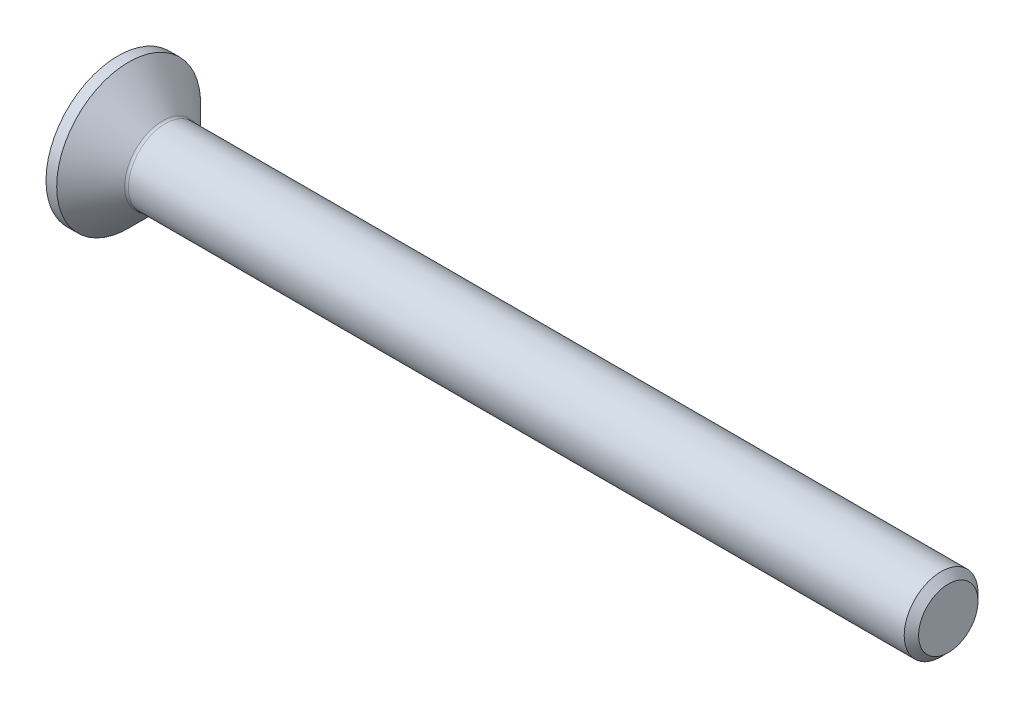
ISO-10303-21;
HEADER;
FILE_DESCRIPTION(('STEP AP214'),'2;1');
FILE_NAME('part.step','',(''),(''),'','','');
FILE_SCHEMA(('AUTOMOTIVE_DESIGN { 1 0 10303 214 1 1 1 1 }'));
ENDSEC;
DATA;
#1=APPLICATION_CONTEXT('core data for automotive mechanical design processes');
#2=APPLICATION_PROTOCOL_DEFINITION('international standard','automotive_design',2000,#1);
#3=PRODUCT_CONTEXT('',#1,'mechanical');
#4=PRODUCT('Part','Part','',(#3));
#5=PRODUCT_RELATED_PRODUCT_CATEGORY('part','',(#4));
#6=PRODUCT_DEFINITION_FORMATION('','',#4);
#7=PRODUCT_DEFINITION_CONTEXT('part definition',#1,'design');
#8=PRODUCT_DEFINITION('design','',#6,#7);
#9=PRODUCT_DEFINITION_SHAPE('','',#8);
#10=(LENGTH_UNIT() NAMED_UNIT(*) SI_UNIT(.MILLI.,.METRE.));
#11=(NAMED_UNIT(*) PLANE_ANGLE_UNIT() SI_UNIT($,.RADIAN.));
#12=(NAMED_UNIT(*) SI_UNIT($,.STERADIAN.) SOLID_ANGLE_UNIT());
#13=UNCERTAINTY_MEASURE_WITH_UNIT(LENGTH_MEASURE(1.E-05),#10,'distance_accuracy_value','');
#14=(GEOMETRIC_REPRESENTATION_CONTEXT(3) GLOBAL_UNCERTAINTY_ASSIGNED_CONTEXT((#13)) GLOBAL_UNIT_ASSIGNED_CONTEXT((#10,
#11,#12)) REPRESENTATION_CONTEXT('',''));
#15=CARTESIAN_POINT('',(0.,0.,0.));
#16=DIRECTION('',(0.,0.,1.));
#17=DIRECTION('',(1.,0.,0.));
#18=AXIS2_PLACEMENT_3D('',#15,#16,#17);
#19=CARTESIAN_POINT('',(0.,0.,0.));
#20=DIRECTION('',(-1.,0.,0.));
#21=DIRECTION('',(0.,0.,1.));
#22=AXIS2_PLACEMENT_3D('',#19,#20,#21);
#23=PLANE('',#22);
#24=CARTESIAN_POINT('',(0.,0.,0.));
#25=DIRECTION('',(-1.,0.,0.));
#26=DIRECTION('',(0.,0.,1.));
#27=AXIS2_PLACEMENT_3D('',#24,#25,#26);
#28=CIRCLE('',#27,3.9);
#29=CARTESIAN_POINT('',(0.,0.,3.9));
#30=VERTEX_POINT('',#29);
#31=EDGE_CURVE('E153',#30,#30,#28,.T.);
#32=ORIENTED_EDGE('',*,*,#31,.T.);
#33=EDGE_LOOP('',(#32));
#34=FACE_BOUND('',#33,.T.);
#35=DIRECTION('',(0.,-0.500000000000001,-0.866025403784438));
#36=VECTOR('',#35,1.);
#37=CARTESIAN_POINT('',(0.,-0.721687836487031,1.25));
#38=LINE('',#37,#36);
#39=CARTESIAN_POINT('',(0.,-0.721687836487031,1.25));
#40=VERTEX_POINT('',#39);
#41=CARTESIAN_POINT('',(0.,-1.44337567297407,0.));
#42=VERTEX_POINT('',#41);
#43=EDGE_CURVE('E115',#40,#42,#38,.T.);
#44=ORIENTED_EDGE('',*,*,#43,.T.);
#45=DIRECTION('',(0.,0.5,-0.866025403784438));
#46=VECTOR('',#45,1.);
#47=CARTESIAN_POINT('',(0.,-1.44337567297407,0.));
#48=LINE('',#47,#46);
#49=CARTESIAN_POINT('',(0.,-0.721687836487032,-1.25));
#50=VERTEX_POINT('',#49);
#51=EDGE_CURVE('E45',#42,#50,#48,.T.);
#52=ORIENTED_EDGE('',*,*,#51,.T.);
#53=DIRECTION('',(0.,1.,0.));
#54=VECTOR('',#53,1.);
#55=CARTESIAN_POINT('',(0.,-0.721687836487032,-1.25));
#56=LINE('',#55,#54);
#57=CARTESIAN_POINT('',(0.,0.721687836487033,-1.25));
#58=VERTEX_POINT('',#57);
#59=EDGE_CURVE('E130',#50,#58,#56,.T.);
#60=ORIENTED_EDGE('',*,*,#59,.T.);
#61=DIRECTION('',(0.,0.500000000000001,0.866025403784438));
#62=VECTOR('',#61,1.);
#63=CARTESIAN_POINT('',(0.,0.721687836487033,-1.25));
#64=LINE('',#63,#62);
#65=CARTESIAN_POINT('',(0.,1.44337567297407,0.));
#66=VERTEX_POINT('',#65);
#67=EDGE_CURVE('E266',#58,#66,#64,.T.);
#68=ORIENTED_EDGE('',*,*,#67,.T.);
#69=DIRECTION('',(0.,-0.5,0.866025403784439));
#70=VECTOR('',#69,1.);
#71=CARTESIAN_POINT('',(0.,1.44337567297407,0.));
#72=LINE('',#71,#70);
#73=CARTESIAN_POINT('',(0.,0.721687836487033,1.25));
#74=VERTEX_POINT('',#73);
#75=EDGE_CURVE('E269',#66,#74,#72,.T.);
#76=ORIENTED_EDGE('',*,*,#75,.T.);
#77=DIRECTION('',(0.,-1.,0.));
#78=VECTOR('',#77,1.);
#79=CARTESIAN_POINT('',(0.,0.721687836487033,1.25));
#80=LINE('',#79,#78);
#81=EDGE_CURVE('E272',#74,#40,#80,.T.);
#82=ORIENTED_EDGE('',*,*,#81,.T.);
#83=EDGE_LOOP('',(#44,#52,#60,#68,#76,#82));
#84=FACE_BOUND('',#83,.T.);
#85=ADVANCED_FACE('F30',(#34,#84),#23,.T.);
#86=CARTESIAN_POINT('',(0.,0.,0.));
#87=DIRECTION('',(-1.,0.,0.));
#88=DIRECTION('',(0.,0.,1.));
#89=AXIS2_PLACEMENT_3D('',#86,#87,#88);
#90=CYLINDRICAL_SURFACE('',#89,3.9);
#91=CARTESIAN_POINT('',(0.580000000000009,0.,0.));
#92=DIRECTION('',(-1.,0.,0.));
#93=DIRECTION('',(0.,0.,1.));
#94=AXIS2_PLACEMENT_3D('',#91,#92,#93);
#95=CIRCLE('',#94,3.9);
#96=CARTESIAN_POINT('',(0.580000000000009,0.,3.9));
#97=VERTEX_POINT('',#96);
#98=EDGE_CURVE('E150',#97,#97,#95,.T.);
#99=ORIENTED_EDGE('',*,*,#98,.T.);
#100=EDGE_LOOP('',(#99));
#101=FACE_BOUND('',#100,.T.);
#102=ORIENTED_EDGE('',*,*,#31,.F.);
#103=EDGE_LOOP('',(#102));
#104=FACE_BOUND('',#103,.T.);
#105=ADVANCED_FACE('F174',(#101,#104),#90,.T.);
#106=CARTESIAN_POINT('',(0.580000000000009,0.,0.));
#107=DIRECTION('',(-1.,0.,0.));
#108=DIRECTION('',(0.,0.,1.));
#109=AXIS2_PLACEMENT_3D('',#106,#107,#108);
#110=CONICAL_SURFACE('',#109,3.9,0.785398163397451);
#111=CARTESIAN_POINT('',(2.42142135623731,0.,0.));
#112=DIRECTION('',(-1.,0.,0.));
#113=DIRECTION('',(0.,0.,1.));
#114=AXIS2_PLACEMENT_3D('',#111,#112,#113);
#115=CIRCLE('',#114,2.05857864376269);
#116=CARTESIAN_POINT('',(2.42142135623731,0.,2.05857864376269));
#117=VERTEX_POINT('',#116);
#118=EDGE_CURVE('E38',#117,#117,#115,.T.);
#119=ORIENTED_EDGE('',*,*,#118,.T.);
#120=EDGE_LOOP('',(#119));
#121=FACE_BOUND('',#120,.T.);
#122=ORIENTED_EDGE('',*,*,#98,.F.);
#123=EDGE_LOOP('',(#122));
#124=FACE_BOUND('',#123,.T.);
#125=ADVANCED_FACE('F158',(#121,#124),#110,.T.);
#126=CARTESIAN_POINT('',(0.,0.,0.));
#127=DIRECTION('',(-1.,0.,0.));
#128=DIRECTION('',(0.,0.,1.));
#129=AXIS2_PLACEMENT_3D('',#126,#127,#128);
#130=CYLINDRICAL_SURFACE('',#129,2.);
#131=CARTESIAN_POINT('',(2.56284271247462,0.,0.));
#132=DIRECTION('',(-1.,0.,0.));
#133=DIRECTION('',(0.,0.,1.));
#134=AXIS2_PLACEMENT_3D('',#131,#132,#133);
#135=CIRCLE('',#134,2.);
#136=CARTESIAN_POINT('',(2.56284271247462,0.,2.));
#137=VERTEX_POINT('',#136);
#138=EDGE_CURVE('E11',#137,#137,#135,.F.);
#139=ORIENTED_EDGE('',*,*,#138,.T.);
#140=EDGE_LOOP('',(#139));
#141=FACE_BOUND('',#140,.T.);
#142=CARTESIAN_POINT('',(44.61,0.,0.));
#143=DIRECTION('',(-1.,0.,0.));
#144=DIRECTION('',(0.,0.,1.));
#145=AXIS2_PLACEMENT_3D('',#142,#143,#144);
#146=CIRCLE('',#145,2.);
#147=CARTESIAN_POINT('',(44.61,0.,2.));
#148=VERTEX_POINT('',#147);
#149=EDGE_CURVE('E147',#148,#148,#146,.T.);
#150=ORIENTED_EDGE('',*,*,#149,.T.);
#151=EDGE_LOOP('',(#150));
#152=FACE_BOUND('',#151,.T.);
#153=ADVANCED_FACE('F185',(#141,#152),#130,.T.);
#154=CARTESIAN_POINT('',(45.,0.,0.));
#155=DIRECTION('',(-1.,0.,0.));
#156=DIRECTION('',(0.,0.,1.));
#157=AXIS2_PLACEMENT_3D('',#154,#155,#156);
#158=CONICAL_SURFACE('',#157,1.61,0.785398163397435);
#159=ORIENTED_EDGE('',*,*,#149,.F.);
#160=EDGE_LOOP('',(#159));
#161=FACE_BOUND('',#160,.T.);
#162=CARTESIAN_POINT('',(45.,0.,0.));
#163=DIRECTION('',(-1.,0.,0.));
#164=DIRECTION('',(0.,0.,1.));
#165=AXIS2_PLACEMENT_3D('',#162,#163,#164);
#166=CIRCLE('',#165,1.61);
#167=CARTESIAN_POINT('',(45.,0.,1.61));
#168=VERTEX_POINT('',#167);
#169=EDGE_CURVE('E143',#168,#168,#166,.T.);
#170=ORIENTED_EDGE('',*,*,#169,.T.);
#171=EDGE_LOOP('',(#170));
#172=FACE_BOUND('',#171,.T.);
#173=ADVANCED_FACE('F169',(#161,#172),#158,.T.);
#174=CARTESIAN_POINT('',(45.,1.61,0.));
#175=DIRECTION('',(1.,0.,0.));
#176=DIRECTION('',(0.,0.,-1.));
#177=AXIS2_PLACEMENT_3D('',#174,#175,#176);
#178=PLANE('',#177);
#179=ORIENTED_EDGE('',*,*,#169,.F.);
#180=EDGE_LOOP('',(#179));
#181=FACE_BOUND('',#180,.T.);
#182=ADVANCED_FACE('F162',(#181),#178,.T.);
#183=CARTESIAN_POINT('',(2.56284271247462,0.,0.));
#184=DIRECTION('',(-1.,0.,0.));
#185=DIRECTION('',(0.,0.,1.));
#186=AXIS2_PLACEMENT_3D('',#183,#184,#185);
#187=TOROIDAL_SURFACE('',#186,2.2,0.2);
#188=ORIENTED_EDGE('',*,*,#138,.F.);
#189=EDGE_LOOP('',(#188));
#190=FACE_BOUND('',#189,.T.);
#191=ORIENTED_EDGE('',*,*,#118,.F.);
#192=EDGE_LOOP('',(#191));
#193=FACE_BOUND('',#192,.T.);
#194=ADVANCED_FACE('F32',(#190,#193),#187,.F.);
#195=CARTESIAN_POINT('',(1.5,-1.44337567297407,0.));
#196=DIRECTION('',(0.,0.866025403784438,0.500000000000001));
#197=DIRECTION('',(0.,-0.500000000000001,0.866025403784438));
#198=AXIS2_PLACEMENT_3D('',#195,#196,#197);
#199=PLANE('',#198);
#200=ORIENTED_EDGE('',*,*,#51,.F.);
#201=DIRECTION('',(-1.,0.,0.));
#202=VECTOR('',#201,1.);
#203=CARTESIAN_POINT('',(1.5,-1.44337567297407,0.));
#204=LINE('',#203,#202);
#205=CARTESIAN_POINT('',(1.5,-1.44337567297407,0.));
#206=VERTEX_POINT('',#205);
#207=EDGE_CURVE('E263',#206,#42,#204,.T.);
#208=ORIENTED_EDGE('',*,*,#207,.F.);
#209=DIRECTION('',(0.,0.5,-0.866025403784438));
#210=VECTOR('',#209,1.);
#211=CARTESIAN_POINT('',(1.5,-1.44337567297407,0.));
#212=LINE('',#211,#210);
#213=CARTESIAN_POINT('',(1.5,-1.08253175473055,-0.625000000000001));
#214=VERTEX_POINT('',#213);
#215=EDGE_CURVE('E112',#206,#214,#212,.T.);
#216=ORIENTED_EDGE('',*,*,#215,.T.);
#217=CARTESIAN_POINT('',(1.5,-0.721687836487032,-1.25));
#218=VERTEX_POINT('',#217);
#219=EDGE_CURVE('E106',#214,#218,#212,.T.);
#220=ORIENTED_EDGE('',*,*,#219,.T.);
#221=DIRECTION('',(-1.,0.,0.));
#222=VECTOR('',#221,1.);
#223=CARTESIAN_POINT('',(1.5,-0.721687836487032,-1.25));
#224=LINE('',#223,#222);
#225=EDGE_CURVE('E110',#218,#50,#224,.T.);
#226=ORIENTED_EDGE('',*,*,#225,.T.);
#227=EDGE_LOOP('',(#200,#208,#216,#220,#226));
#228=FACE_BOUND('',#227,.T.);
#229=ADVANCED_FACE('F108',(#228),#199,.T.);
#230=CARTESIAN_POINT('',(1.5,-0.721687836487032,-1.25));
#231=DIRECTION('',(0.,0.,1.));
#232=DIRECTION('',(0.,-1.,0.));
#233=AXIS2_PLACEMENT_3D('',#230,#231,#232);
#234=PLANE('',#233);
#235=ORIENTED_EDGE('',*,*,#59,.F.);
#236=ORIENTED_EDGE('',*,*,#225,.F.);
#237=DIRECTION('',(0.,1.,0.));
#238=VECTOR('',#237,1.);
#239=CARTESIAN_POINT('',(1.5,-0.721687836487032,-1.25));
#240=LINE('',#239,#238);
#241=CARTESIAN_POINT('',(1.5,0.,-1.25));
#242=VERTEX_POINT('',#241);
#243=EDGE_CURVE('E118',#218,#242,#240,.T.);
#244=ORIENTED_EDGE('',*,*,#243,.T.);
#245=CARTESIAN_POINT('',(1.5,0.721687836487033,-1.25));
#246=VERTEX_POINT('',#245);
#247=EDGE_CURVE('E125',#242,#246,#240,.T.);
#248=ORIENTED_EDGE('',*,*,#247,.T.);
#249=DIRECTION('',(-1.,0.,0.));
#250=VECTOR('',#249,1.);
#251=CARTESIAN_POINT('',(1.5,0.721687836487033,-1.25));
#252=LINE('',#251,#250);
#253=EDGE_CURVE('E132',#246,#58,#252,.T.);
#254=ORIENTED_EDGE('',*,*,#253,.T.);
#255=EDGE_LOOP('',(#235,#236,#244,#248,#254));
#256=FACE_BOUND('',#255,.T.);
#257=ADVANCED_FACE('F127',(#256),#234,.T.);
#258=CARTESIAN_POINT('',(1.5,0.721687836487033,-1.25));
#259=DIRECTION('',(0.,-0.866025403784438,0.5));
#260=DIRECTION('',(0.,-0.500000000000001,-0.866025403784438));
#261=AXIS2_PLACEMENT_3D('',#258,#259,#260);
#262=PLANE('',#261);
#263=ORIENTED_EDGE('',*,*,#67,.F.);
#264=ORIENTED_EDGE('',*,*,#253,.F.);
#265=DIRECTION('',(0.,0.500000000000001,0.866025403784438));
#266=VECTOR('',#265,1.);
#267=CARTESIAN_POINT('',(1.5,0.721687836487033,-1.25));
#268=LINE('',#267,#266);
#269=CARTESIAN_POINT('',(1.5,1.08253175473055,-0.625000000000001));
#270=VERTEX_POINT('',#269);
#271=EDGE_CURVE('E255',#246,#270,#268,.T.);
#272=ORIENTED_EDGE('',*,*,#271,.T.);
#273=CARTESIAN_POINT('',(1.5,1.44337567297407,0.));
#274=VERTEX_POINT('',#273);
#275=EDGE_CURVE('E124',#270,#274,#268,.T.);
#276=ORIENTED_EDGE('',*,*,#275,.T.);
#277=DIRECTION('',(-1.,0.,0.));
#278=VECTOR('',#277,1.);
#279=CARTESIAN_POINT('',(1.5,1.44337567297407,0.));
#280=LINE('',#279,#278);
#281=EDGE_CURVE('E138',#274,#66,#280,.T.);
#282=ORIENTED_EDGE('',*,*,#281,.T.);
#283=EDGE_LOOP('',(#263,#264,#272,#276,#282));
#284=FACE_BOUND('',#283,.T.);
#285=ADVANCED_FACE('F199',(#284),#262,.T.);
#286=CARTESIAN_POINT('',(1.5,1.44337567297407,0.));
#287=DIRECTION('',(0.,-0.866025403784439,-0.5));
#288=DIRECTION('',(0.,0.5,-0.866025403784439));
#289=AXIS2_PLACEMENT_3D('',#286,#287,#288);
#290=PLANE('',#289);
#291=ORIENTED_EDGE('',*,*,#75,.F.);
#292=ORIENTED_EDGE('',*,*,#281,.F.);
#293=DIRECTION('',(0.,-0.5,0.866025403784439));
#294=VECTOR('',#293,1.);
#295=CARTESIAN_POINT('',(1.5,1.44337567297407,0.));
#296=LINE('',#295,#294);
#297=CARTESIAN_POINT('',(1.5,1.08253175473055,0.625));
#298=VERTEX_POINT('',#297);
#299=EDGE_CURVE('E53',#274,#298,#296,.T.);
#300=ORIENTED_EDGE('',*,*,#299,.T.);
#301=CARTESIAN_POINT('',(1.5,0.721687836487033,1.25));
#302=VERTEX_POINT('',#301);
#303=EDGE_CURVE('E234',#298,#302,#296,.T.);
#304=ORIENTED_EDGE('',*,*,#303,.T.);
#305=DIRECTION('',(-1.,0.,0.));
#306=VECTOR('',#305,1.);
#307=CARTESIAN_POINT('',(1.5,0.721687836487033,1.25));
#308=LINE('',#307,#306);
#309=EDGE_CURVE('E248',#302,#74,#308,.T.);
#310=ORIENTED_EDGE('',*,*,#309,.T.);
#311=EDGE_LOOP('',(#291,#292,#300,#304,#310));
#312=FACE_BOUND('',#311,.T.);
#313=ADVANCED_FACE('F202',(#312),#290,.T.);
#314=CARTESIAN_POINT('',(1.5,0.721687836487033,1.25));
#315=DIRECTION('',(0.,0.,-1.));
#316=DIRECTION('',(0.,1.,0.));
#317=AXIS2_PLACEMENT_3D('',#314,#315,#316);
#318=PLANE('',#317);
#319=ORIENTED_EDGE('',*,*,#81,.F.);
#320=ORIENTED_EDGE('',*,*,#309,.F.);
#321=DIRECTION('',(0.,-1.,0.));
#322=VECTOR('',#321,1.);
#323=CARTESIAN_POINT('',(1.5,0.721687836487033,1.25));
#324=LINE('',#323,#322);
#325=CARTESIAN_POINT('',(1.5,0.,1.25));
#326=VERTEX_POINT('',#325);
#327=EDGE_CURVE('E233',#302,#326,#324,.T.);
#328=ORIENTED_EDGE('',*,*,#327,.T.);
#329=CARTESIAN_POINT('',(1.5,-0.721687836487031,1.25));
#330=VERTEX_POINT('',#329);
#331=EDGE_CURVE('E239',#326,#330,#324,.T.);
#332=ORIENTED_EDGE('',*,*,#331,.T.);
#333=DIRECTION('',(-1.,0.,0.));
#334=VECTOR('',#333,1.);
#335=CARTESIAN_POINT('',(1.5,-0.721687836487031,1.25));
#336=LINE('',#335,#334);
#337=EDGE_CURVE('E278',#330,#40,#336,.T.);
#338=ORIENTED_EDGE('',*,*,#337,.T.);
#339=EDGE_LOOP('',(#319,#320,#328,#332,#338));
#340=FACE_BOUND('',#339,.T.);
#341=ADVANCED_FACE('F206',(#340),#318,.T.);
#342=CARTESIAN_POINT('',(1.5,-0.721687836487031,1.25));
#343=DIRECTION('',(0.,0.866025403784438,-0.500000000000001));
#344=DIRECTION('',(0.,0.500000000000001,0.866025403784438));
#345=AXIS2_PLACEMENT_3D('',#342,#343,#344);
#346=PLANE('',#345);
#347=ORIENTED_EDGE('',*,*,#43,.F.);
#348=ORIENTED_EDGE('',*,*,#337,.F.);
#349=DIRECTION('',(0.,-0.500000000000001,-0.866025403784438));
#350=VECTOR('',#349,1.);
#351=CARTESIAN_POINT('',(1.5,-0.721687836487031,1.25));
#352=LINE('',#351,#350);
#353=CARTESIAN_POINT('',(1.5,-1.08253175473055,0.625000000000002));
#354=VERTEX_POINT('',#353);
#355=EDGE_CURVE('E242',#330,#354,#352,.T.);
#356=ORIENTED_EDGE('',*,*,#355,.T.);
#357=EDGE_CURVE('E249',#354,#206,#352,.T.);
#358=ORIENTED_EDGE('',*,*,#357,.T.);
#359=ORIENTED_EDGE('',*,*,#207,.T.);
#360=EDGE_LOOP('',(#347,#348,#356,#358,#359));
#361=FACE_BOUND('',#360,.T.);
#362=ADVANCED_FACE('F209',(#361),#346,.T.);
#363=CARTESIAN_POINT('',(1.5,-1.44337567297407,0.));
#364=DIRECTION('',(-1.,0.,0.));
#365=DIRECTION('',(0.,0.,1.));
#366=AXIS2_PLACEMENT_3D('',#363,#364,#365);
#367=PLANE('',#366);
#368=CARTESIAN_POINT('',(1.5,0.,0.));
#369=DIRECTION('',(-1.,0.,0.));
#370=DIRECTION('',(0.,0.,1.));
#371=AXIS2_PLACEMENT_3D('',#368,#369,#370);
#372=CIRCLE('',#371,1.25);
#373=EDGE_CURVE('E131',#354,#326,#372,.T.);
#374=ORIENTED_EDGE('',*,*,#373,.F.);
#375=ORIENTED_EDGE('',*,*,#355,.F.);
#376=ORIENTED_EDGE('',*,*,#331,.F.);
#377=EDGE_LOOP('',(#374,#375,#376));
#378=FACE_BOUND('',#377,.T.);
#379=ADVANCED_FACE('F213',(#378),#367,.T.);
#380=EDGE_CURVE('E135',#214,#354,#372,.T.);
#381=ORIENTED_EDGE('',*,*,#380,.F.);
#382=ORIENTED_EDGE('',*,*,#215,.F.);
#383=ORIENTED_EDGE('',*,*,#357,.F.);
#384=EDGE_LOOP('',(#381,#382,#383));
#385=FACE_BOUND('',#384,.T.);
#386=ADVANCED_FACE('F216',(#385),#367,.T.);
#387=EDGE_CURVE('E120',#242,#214,#372,.T.);
#388=ORIENTED_EDGE('',*,*,#387,.F.);
#389=ORIENTED_EDGE('',*,*,#243,.F.);
#390=ORIENTED_EDGE('',*,*,#219,.F.);
#391=EDGE_LOOP('',(#388,#389,#390));
#392=FACE_BOUND('',#391,.T.);
#393=ADVANCED_FACE('F119',(#392),#367,.T.);
#394=EDGE_CURVE('E251',#270,#242,#372,.T.);
#395=ORIENTED_EDGE('',*,*,#394,.F.);
#396=ORIENTED_EDGE('',*,*,#271,.F.);
#397=ORIENTED_EDGE('',*,*,#247,.F.);
#398=EDGE_LOOP('',(#395,#396,#397));
#399=FACE_BOUND('',#398,.T.);
#400=ADVANCED_FACE('F228',(#399),#367,.T.);
#401=EDGE_CURVE('E144',#298,#270,#372,.T.);
#402=ORIENTED_EDGE('',*,*,#401,.F.);
#403=ORIENTED_EDGE('',*,*,#299,.F.);
#404=ORIENTED_EDGE('',*,*,#275,.F.);
#405=EDGE_LOOP('',(#402,#403,#404));
#406=FACE_BOUND('',#405,.T.);
#407=ADVANCED_FACE('F223',(#406),#367,.T.);
#408=EDGE_CURVE('E137',#326,#298,#372,.T.);
#409=ORIENTED_EDGE('',*,*,#408,.F.);
#410=ORIENTED_EDGE('',*,*,#327,.F.);
#411=ORIENTED_EDGE('',*,*,#303,.F.);
#412=EDGE_LOOP('',(#409,#410,#411));
#413=FACE_BOUND('',#412,.T.);
#414=ADVANCED_FACE('F194',(#413),#367,.T.);
#415=CARTESIAN_POINT('',(1.5,0.,0.));
#416=DIRECTION('',(-1.,0.,0.));
#417=DIRECTION('',(0.,0.,1.));
#418=AXIS2_PLACEMENT_3D('',#415,#416,#417);
#419=CONICAL_SURFACE('',#418,1.25,1.04719755119659);
#420=CARTESIAN_POINT('',(2.22168783648704,0.,0.));
#421=VERTEX_POINT('',#420);
#422=VERTEX_LOOP('',#421);
#423=FACE_BOUND('',#422,.T.);
#424=ORIENTED_EDGE('',*,*,#408,.T.);
#425=ORIENTED_EDGE('',*,*,#401,.T.);
#426=ORIENTED_EDGE('',*,*,#394,.T.);
#427=ORIENTED_EDGE('',*,*,#387,.T.);
#428=ORIENTED_EDGE('',*,*,#380,.T.);
#429=ORIENTED_EDGE('',*,*,#373,.T.);
#430=EDGE_LOOP('',(#424,#425,#426,#427,#428,#429));
#431=FACE_BOUND('',#430,.T.);
#432=ADVANCED_FACE('F192',(#423,#431),#419,.F.);
#433=CLOSED_SHELL('',(#85,#105,#125,#153,#173,#182,#194,#229,#257,#285,#313,#341,#362,#379,#386,
#393,#400,#407,#414,#432));
#434=MANIFOLD_SOLID_BREP('B2',#433);
#435=ADVANCED_BREP_SHAPE_REPRESENTATION('',(#18,#434),#14);
#436=SHAPE_DEFINITION_REPRESENTATION(#9,#435);
ENDSEC;
END-ISO-10303-21;
